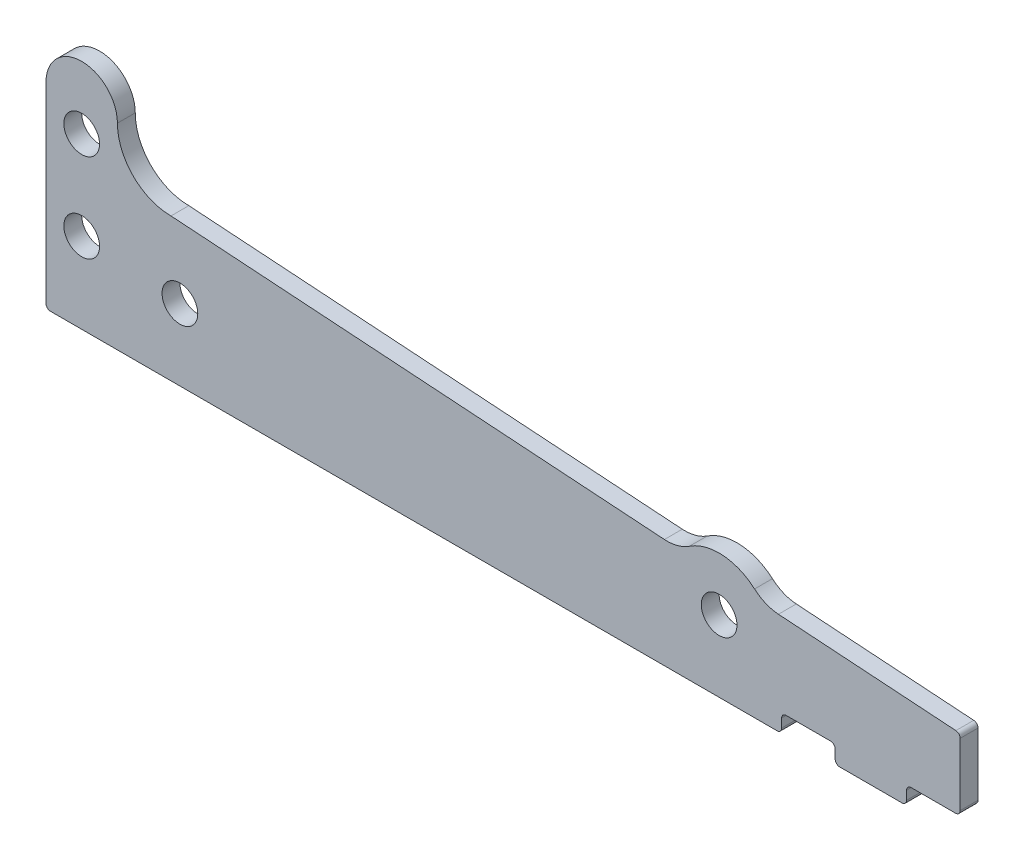
ISO-10303-21;
HEADER;
FILE_DESCRIPTION(('STEP AP214'),'2;1');
FILE_NAME('part.step','',(''),(''),'','','');
FILE_SCHEMA(('AUTOMOTIVE_DESIGN { 1 0 10303 214 1 1 1 1 }'));
ENDSEC;
DATA;
#1=APPLICATION_CONTEXT('core data for automotive mechanical design processes');
#2=APPLICATION_PROTOCOL_DEFINITION('international standard','automotive_design',2000,#1);
#3=PRODUCT_CONTEXT('',#1,'mechanical');
#4=PRODUCT('Part','Part','',(#3));
#5=PRODUCT_RELATED_PRODUCT_CATEGORY('part','',(#4));
#6=PRODUCT_DEFINITION_FORMATION('','',#4);
#7=PRODUCT_DEFINITION_CONTEXT('part definition',#1,'design');
#8=PRODUCT_DEFINITION('design','',#6,#7);
#9=PRODUCT_DEFINITION_SHAPE('','',#8);
#10=(LENGTH_UNIT() NAMED_UNIT(*) SI_UNIT(.MILLI.,.METRE.));
#11=(NAMED_UNIT(*) PLANE_ANGLE_UNIT() SI_UNIT($,.RADIAN.));
#12=(NAMED_UNIT(*) SI_UNIT($,.STERADIAN.) SOLID_ANGLE_UNIT());
#13=UNCERTAINTY_MEASURE_WITH_UNIT(LENGTH_MEASURE(1.E-05),#10,'distance_accuracy_value','');
#14=(GEOMETRIC_REPRESENTATION_CONTEXT(3) GLOBAL_UNCERTAINTY_ASSIGNED_CONTEXT((#13)) GLOBAL_UNIT_ASSIGNED_CONTEXT((#10,
#11,#12)) REPRESENTATION_CONTEXT('',''));
#15=CARTESIAN_POINT('',(0.,0.,0.));
#16=DIRECTION('',(0.,0.,1.));
#17=DIRECTION('',(1.,0.,0.));
#18=AXIS2_PLACEMENT_3D('',#15,#16,#17);
#19=CARTESIAN_POINT('',(11.1125,15.875,1.5875));
#20=DIRECTION('',(0.,0.,-1.));
#21=DIRECTION('',(-1.,0.,0.));
#22=AXIS2_PLACEMENT_3D('',#19,#20,#21);
#23=CYLINDRICAL_SURFACE('',#22,4.76250000000001);
#24=CARTESIAN_POINT('',(11.1125,15.875,0.));
#25=DIRECTION('',(0.,0.,1.));
#26=DIRECTION('',(1.,0.,0.));
#27=AXIS2_PLACEMENT_3D('',#24,#25,#26);
#28=CIRCLE('',#27,4.76250000000001);
#29=CARTESIAN_POINT('',(6.34999999999999,15.875,0.));
#30=VERTEX_POINT('',#29);
#31=CARTESIAN_POINT('',(11.1125,11.1125,0.));
#32=VERTEX_POINT('',#31);
#33=EDGE_CURVE('E210',#30,#32,#28,.T.);
#34=ORIENTED_EDGE('',*,*,#33,.F.);
#35=DIRECTION('',(0.,0.,-1.));
#36=VECTOR('',#35,1.);
#37=CARTESIAN_POINT('',(6.34999999999999,15.875,1.5875));
#38=LINE('',#37,#36);
#39=CARTESIAN_POINT('',(6.34999999999999,15.875,1.5875));
#40=VERTEX_POINT('',#39);
#41=EDGE_CURVE('E204',#40,#30,#38,.T.);
#42=ORIENTED_EDGE('',*,*,#41,.F.);
#43=CARTESIAN_POINT('',(11.1125,15.875,1.5875));
#44=DIRECTION('',(0.,0.,1.));
#45=DIRECTION('',(1.,0.,0.));
#46=AXIS2_PLACEMENT_3D('',#43,#44,#45);
#47=CIRCLE('',#46,4.76250000000001);
#48=CARTESIAN_POINT('',(11.1125,11.1125,1.5875));
#49=VERTEX_POINT('',#48);
#50=EDGE_CURVE('E207',#40,#49,#47,.T.);
#51=ORIENTED_EDGE('',*,*,#50,.T.);
#52=DIRECTION('',(0.,0.,-1.));
#53=VECTOR('',#52,1.);
#54=CARTESIAN_POINT('',(11.1125,11.1125,1.5875));
#55=LINE('',#54,#53);
#56=EDGE_CURVE('E276',#49,#32,#55,.T.);
#57=ORIENTED_EDGE('',*,*,#56,.T.);
#58=EDGE_LOOP('',(#34,#42,#51,#57));
#59=FACE_BOUND('',#58,.T.);
#60=ADVANCED_FACE('F39',(#59),#23,.F.);
#61=CARTESIAN_POINT('',(3.17499999999999,15.875,1.5875));
#62=DIRECTION('',(0.,0.,-1.));
#63=DIRECTION('',(-1.,0.,0.));
#64=AXIS2_PLACEMENT_3D('',#61,#62,#63);
#65=CYLINDRICAL_SURFACE('',#64,3.17499999999999);
#66=CARTESIAN_POINT('',(3.17499999999999,15.875,0.));
#67=DIRECTION('',(0.,0.,1.));
#68=DIRECTION('',(1.,0.,0.));
#69=AXIS2_PLACEMENT_3D('',#66,#67,#68);
#70=CIRCLE('',#69,3.17499999999999);
#71=CARTESIAN_POINT('',(0.,15.875,0.));
#72=VERTEX_POINT('',#71);
#73=EDGE_CURVE('E278',#30,#72,#70,.T.);
#74=ORIENTED_EDGE('',*,*,#73,.T.);
#75=DIRECTION('',(0.,0.,-1.));
#76=VECTOR('',#75,1.);
#77=CARTESIAN_POINT('',(0.,15.875,1.5875));
#78=LINE('',#77,#76);
#79=CARTESIAN_POINT('',(0.,15.875,1.5875));
#80=VERTEX_POINT('',#79);
#81=EDGE_CURVE('E215',#80,#72,#78,.T.);
#82=ORIENTED_EDGE('',*,*,#81,.F.);
#83=CARTESIAN_POINT('',(3.17499999999999,15.875,1.5875));
#84=DIRECTION('',(0.,0.,1.));
#85=DIRECTION('',(1.,0.,0.));
#86=AXIS2_PLACEMENT_3D('',#83,#84,#85);
#87=CIRCLE('',#86,3.17499999999999);
#88=EDGE_CURVE('E219',#40,#80,#87,.T.);
#89=ORIENTED_EDGE('',*,*,#88,.F.);
#90=ORIENTED_EDGE('',*,*,#41,.T.);
#91=EDGE_LOOP('',(#74,#82,#89,#90));
#92=FACE_BOUND('',#91,.T.);
#93=ADVANCED_FACE('F220',(#92),#65,.T.);
#94=CARTESIAN_POINT('',(0.,0.,1.5875));
#95=DIRECTION('',(-1.,0.,0.));
#96=DIRECTION('',(0.,0.,1.));
#97=AXIS2_PLACEMENT_3D('',#94,#95,#96);
#98=PLANE('',#97);
#99=DIRECTION('',(0.,1.,0.));
#100=VECTOR('',#99,1.);
#101=CARTESIAN_POINT('',(0.,0.,0.));
#102=LINE('',#101,#100);
#103=CARTESIAN_POINT('',(0.,-1.1811,0.));
#104=VERTEX_POINT('',#103);
#105=EDGE_CURVE('E280',#104,#72,#102,.T.);
#106=ORIENTED_EDGE('',*,*,#105,.F.);
#107=DIRECTION('',(0.,0.,-1.));
#108=VECTOR('',#107,1.);
#109=CARTESIAN_POINT('',(0.,-1.1811,1.5875));
#110=LINE('',#109,#108);
#111=CARTESIAN_POINT('',(0.,-1.1811,1.5875));
#112=VERTEX_POINT('',#111);
#113=EDGE_CURVE('E336',#104,#112,#110,.F.);
#114=ORIENTED_EDGE('',*,*,#113,.T.);
#115=DIRECTION('',(0.,1.,0.));
#116=VECTOR('',#115,1.);
#117=CARTESIAN_POINT('',(0.,0.,1.5875));
#118=LINE('',#117,#116);
#119=EDGE_CURVE('E224',#112,#80,#118,.T.);
#120=ORIENTED_EDGE('',*,*,#119,.T.);
#121=ORIENTED_EDGE('',*,*,#81,.T.);
#122=EDGE_LOOP('',(#106,#114,#120,#121));
#123=FACE_BOUND('',#122,.T.);
#124=ADVANCED_FACE('F513',(#123),#98,.T.);
#125=CARTESIAN_POINT('',(0.,-1.5875,1.5875));
#126=DIRECTION('',(0.,1.,0.));
#127=DIRECTION('',(0.,0.,1.));
#128=AXIS2_PLACEMENT_3D('',#125,#126,#127);
#129=PLANE('',#128);
#130=DIRECTION('',(1.,0.,0.));
#131=VECTOR('',#130,1.);
#132=CARTESIAN_POINT('',(0.,-1.5875,1.5875));
#133=LINE('',#132,#131);
#134=CARTESIAN_POINT('',(0.4064,-1.5875,1.5875));
#135=VERTEX_POINT('',#134);
#136=CARTESIAN_POINT('',(65.0010384,-1.5875,1.5875));
#137=VERTEX_POINT('',#136);
#138=EDGE_CURVE('E237',#135,#137,#133,.T.);
#139=ORIENTED_EDGE('',*,*,#138,.F.);
#140=DIRECTION('',(0.,0.,-1.));
#141=VECTOR('',#140,1.);
#142=CARTESIAN_POINT('',(0.4064,-1.5875,0.));
#143=LINE('',#142,#141);
#144=CARTESIAN_POINT('',(0.4064,-1.5875,0.));
#145=VERTEX_POINT('',#144);
#146=EDGE_CURVE('E321',#135,#145,#143,.T.);
#147=ORIENTED_EDGE('',*,*,#146,.T.);
#148=DIRECTION('',(1.,0.,0.));
#149=VECTOR('',#148,1.);
#150=CARTESIAN_POINT('',(0.,-1.5875,0.));
#151=LINE('',#150,#149);
#152=CARTESIAN_POINT('',(65.0010384,-1.5875,0.));
#153=VERTEX_POINT('',#152);
#154=EDGE_CURVE('E282',#145,#153,#151,.T.);
#155=ORIENTED_EDGE('',*,*,#154,.T.);
#156=DIRECTION('',(0.,0.,-1.));
#157=VECTOR('',#156,1.);
#158=CARTESIAN_POINT('',(65.0010384,-1.5875,1.5875));
#159=LINE('',#158,#157);
#160=EDGE_CURVE('E214',#153,#137,#159,.F.);
#161=ORIENTED_EDGE('',*,*,#160,.T.);
#162=EDGE_LOOP('',(#139,#147,#155,#161));
#163=FACE_BOUND('',#162,.T.);
#164=ADVANCED_FACE('F504',(#163),#129,.F.);
#165=CARTESIAN_POINT('',(65.4074384,0.,1.5875));
#166=DIRECTION('',(1.,0.,0.));
#167=DIRECTION('',(0.,0.,-1.));
#168=AXIS2_PLACEMENT_3D('',#165,#166,#167);
#169=PLANE('',#168);
#170=DIRECTION('',(0.,-1.,0.));
#171=VECTOR('',#170,1.);
#172=CARTESIAN_POINT('',(65.4074384,0.,0.));
#173=LINE('',#172,#171);
#174=CARTESIAN_POINT('',(65.4074384,-0.4064,0.));
#175=VERTEX_POINT('',#174);
#176=CARTESIAN_POINT('',(65.4074384,-1.1811,0.));
#177=VERTEX_POINT('',#176);
#178=EDGE_CURVE('E288',#175,#177,#173,.T.);
#179=ORIENTED_EDGE('',*,*,#178,.F.);
#180=DIRECTION('',(0.,0.,-1.));
#181=VECTOR('',#180,1.);
#182=CARTESIAN_POINT('',(65.4074384,-0.4064,1.5875));
#183=LINE('',#182,#181);
#184=CARTESIAN_POINT('',(65.4074384,-0.4064,1.5875));
#185=VERTEX_POINT('',#184);
#186=EDGE_CURVE('E387',#175,#185,#183,.F.);
#187=ORIENTED_EDGE('',*,*,#186,.T.);
#188=DIRECTION('',(0.,-1.,0.));
#189=VECTOR('',#188,1.);
#190=CARTESIAN_POINT('',(65.4074384,0.,1.5875));
#191=LINE('',#190,#189);
#192=CARTESIAN_POINT('',(65.4074384,-1.1811,1.5875));
#193=VERTEX_POINT('',#192);
#194=EDGE_CURVE('E243',#185,#193,#191,.T.);
#195=ORIENTED_EDGE('',*,*,#194,.T.);
#196=DIRECTION('',(0.,0.,-1.));
#197=VECTOR('',#196,1.);
#198=CARTESIAN_POINT('',(65.4074384,-1.1811,0.));
#199=LINE('',#198,#197);
#200=EDGE_CURVE('E384',#193,#177,#199,.T.);
#201=ORIENTED_EDGE('',*,*,#200,.T.);
#202=EDGE_LOOP('',(#179,#187,#195,#201));
#203=FACE_BOUND('',#202,.T.);
#204=ADVANCED_FACE('F494',(#203),#169,.T.);
#205=CARTESIAN_POINT('',(0.,0.,1.5875));
#206=DIRECTION('',(0.,-1.,0.));
#207=DIRECTION('',(1.,0.,0.));
#208=AXIS2_PLACEMENT_3D('',#205,#206,#207);
#209=PLANE('',#208);
#210=DIRECTION('',(-1.,0.,0.));
#211=VECTOR('',#210,1.);
#212=CARTESIAN_POINT('',(0.,0.,0.));
#213=LINE('',#212,#211);
#214=CARTESIAN_POINT('',(69.7635384,0.,0.));
#215=VERTEX_POINT('',#214);
#216=CARTESIAN_POINT('',(65.8138384,0.,0.));
#217=VERTEX_POINT('',#216);
#218=EDGE_CURVE('E291',#215,#217,#213,.T.);
#219=ORIENTED_EDGE('',*,*,#218,.F.);
#220=DIRECTION('',(0.,0.,-1.));
#221=VECTOR('',#220,1.);
#222=CARTESIAN_POINT('',(69.7635384,0.,1.5875));
#223=LINE('',#222,#221);
#224=CARTESIAN_POINT('',(69.7635384,0.,1.5875));
#225=VERTEX_POINT('',#224);
#226=EDGE_CURVE('E382',#215,#225,#223,.F.);
#227=ORIENTED_EDGE('',*,*,#226,.T.);
#228=DIRECTION('',(-1.,0.,0.));
#229=VECTOR('',#228,1.);
#230=CARTESIAN_POINT('',(0.,0.,1.5875));
#231=LINE('',#230,#229);
#232=CARTESIAN_POINT('',(65.8138384,0.,1.5875));
#233=VERTEX_POINT('',#232);
#234=EDGE_CURVE('E246',#225,#233,#231,.T.);
#235=ORIENTED_EDGE('',*,*,#234,.T.);
#236=DIRECTION('',(0.,0.,-1.));
#237=VECTOR('',#236,1.);
#238=CARTESIAN_POINT('',(65.8138384,0.,0.));
#239=LINE('',#238,#237);
#240=EDGE_CURVE('E379',#233,#217,#239,.T.);
#241=ORIENTED_EDGE('',*,*,#240,.T.);
#242=EDGE_LOOP('',(#219,#227,#235,#241));
#243=FACE_BOUND('',#242,.T.);
#244=ADVANCED_FACE('F485',(#243),#209,.T.);
#245=CARTESIAN_POINT('',(70.1699384,0.,1.5875));
#246=DIRECTION('',(1.,0.,0.));
#247=DIRECTION('',(0.,0.,-1.));
#248=AXIS2_PLACEMENT_3D('',#245,#246,#247);
#249=PLANE('',#248);
#250=DIRECTION('',(0.,-1.,0.));
#251=VECTOR('',#250,1.);
#252=CARTESIAN_POINT('',(70.1699384,0.,0.));
#253=LINE('',#252,#251);
#254=CARTESIAN_POINT('',(70.1699384,-0.4064,0.));
#255=VERTEX_POINT('',#254);
#256=CARTESIAN_POINT('',(70.1699384,-1.1811,0.));
#257=VERTEX_POINT('',#256);
#258=EDGE_CURVE('E287',#255,#257,#253,.T.);
#259=ORIENTED_EDGE('',*,*,#258,.T.);
#260=DIRECTION('',(0.,0.,-1.));
#261=VECTOR('',#260,1.);
#262=CARTESIAN_POINT('',(70.1699384,-1.1811,1.5875));
#263=LINE('',#262,#261);
#264=CARTESIAN_POINT('',(70.1699384,-1.1811,1.5875));
#265=VERTEX_POINT('',#264);
#266=EDGE_CURVE('E377',#257,#265,#263,.F.);
#267=ORIENTED_EDGE('',*,*,#266,.T.);
#268=DIRECTION('',(0.,-1.,0.));
#269=VECTOR('',#268,1.);
#270=CARTESIAN_POINT('',(70.1699384,0.,1.5875));
#271=LINE('',#270,#269);
#272=CARTESIAN_POINT('',(70.1699384,-0.4064,1.5875));
#273=VERTEX_POINT('',#272);
#274=EDGE_CURVE('E242',#273,#265,#271,.T.);
#275=ORIENTED_EDGE('',*,*,#274,.F.);
#276=DIRECTION('',(0.,0.,-1.));
#277=VECTOR('',#276,1.);
#278=CARTESIAN_POINT('',(70.1699384,-0.4064,1.5875));
#279=LINE('',#278,#277);
#280=EDGE_CURVE('E374',#273,#255,#279,.T.);
#281=ORIENTED_EDGE('',*,*,#280,.T.);
#282=EDGE_LOOP('',(#259,#267,#275,#281));
#283=FACE_BOUND('',#282,.T.);
#284=ADVANCED_FACE('F476',(#283),#249,.F.);
#285=CARTESIAN_POINT('',(70.5763384,-1.5875,0.));
#286=VERTEX_POINT('',#285);
#287=CARTESIAN_POINT('',(76.1135384,-1.5875,0.));
#288=VERTEX_POINT('',#287);
#289=EDGE_CURVE('E283',#286,#288,#151,.T.);
#290=ORIENTED_EDGE('',*,*,#289,.T.);
#291=DIRECTION('',(0.,0.,-1.));
#292=VECTOR('',#291,1.);
#293=CARTESIAN_POINT('',(76.1135384,-1.5875,1.5875));
#294=LINE('',#293,#292);
#295=CARTESIAN_POINT('',(76.1135384,-1.5875,1.5875));
#296=VERTEX_POINT('',#295);
#297=EDGE_CURVE('E372',#288,#296,#294,.F.);
#298=ORIENTED_EDGE('',*,*,#297,.T.);
#299=CARTESIAN_POINT('',(70.5763384,-1.5875,1.5875));
#300=VERTEX_POINT('',#299);
#301=EDGE_CURVE('E238',#300,#296,#133,.T.);
#302=ORIENTED_EDGE('',*,*,#301,.F.);
#303=DIRECTION('',(0.,0.,-1.));
#304=VECTOR('',#303,1.);
#305=CARTESIAN_POINT('',(70.5763384,-1.5875,1.5875));
#306=LINE('',#305,#304);
#307=EDGE_CURVE('E369',#300,#286,#306,.T.);
#308=ORIENTED_EDGE('',*,*,#307,.T.);
#309=EDGE_LOOP('',(#290,#298,#302,#308));
#310=FACE_BOUND('',#309,.T.);
#311=ADVANCED_FACE('F467',(#310),#129,.F.);
#312=CARTESIAN_POINT('',(76.5199384,0.,1.5875));
#313=DIRECTION('',(-1.,0.,0.));
#314=DIRECTION('',(0.,0.,1.));
#315=AXIS2_PLACEMENT_3D('',#312,#313,#314);
#316=PLANE('',#315);
#317=DIRECTION('',(0.,1.,0.));
#318=VECTOR('',#317,1.);
#319=CARTESIAN_POINT('',(76.5199384,0.,0.));
#320=LINE('',#319,#318);
#321=CARTESIAN_POINT('',(76.5199384,-1.1811,0.));
#322=VERTEX_POINT('',#321);
#323=CARTESIAN_POINT('',(76.5199384,-0.4064,0.));
#324=VERTEX_POINT('',#323);
#325=EDGE_CURVE('E286',#322,#324,#320,.T.);
#326=ORIENTED_EDGE('',*,*,#325,.T.);
#327=DIRECTION('',(0.,0.,-1.));
#328=VECTOR('',#327,1.);
#329=CARTESIAN_POINT('',(76.5199384,-0.4064,1.5875));
#330=LINE('',#329,#328);
#331=CARTESIAN_POINT('',(76.5199384,-0.4064,1.5875));
#332=VERTEX_POINT('',#331);
#333=EDGE_CURVE('E367',#324,#332,#330,.F.);
#334=ORIENTED_EDGE('',*,*,#333,.T.);
#335=DIRECTION('',(0.,1.,0.));
#336=VECTOR('',#335,1.);
#337=CARTESIAN_POINT('',(76.5199384,0.,1.5875));
#338=LINE('',#337,#336);
#339=CARTESIAN_POINT('',(76.5199384,-1.1811,1.5875));
#340=VERTEX_POINT('',#339);
#341=EDGE_CURVE('E241',#340,#332,#338,.T.);
#342=ORIENTED_EDGE('',*,*,#341,.F.);
#343=DIRECTION('',(0.,0.,-1.));
#344=VECTOR('',#343,1.);
#345=CARTESIAN_POINT('',(76.5199384,-1.1811,1.5875));
#346=LINE('',#345,#344);
#347=EDGE_CURVE('E364',#340,#322,#346,.T.);
#348=ORIENTED_EDGE('',*,*,#347,.T.);
#349=EDGE_LOOP('',(#326,#334,#342,#348));
#350=FACE_BOUND('',#349,.T.);
#351=ADVANCED_FACE('F458',(#350),#316,.F.);
#352=CARTESIAN_POINT('',(0.,0.,1.5875));
#353=DIRECTION('',(0.,-1.,0.));
#354=DIRECTION('',(0.,0.,-1.));
#355=AXIS2_PLACEMENT_3D('',#352,#353,#354);
#356=PLANE('',#355);
#357=DIRECTION('',(-1.,0.,0.));
#358=VECTOR('',#357,1.);
#359=CARTESIAN_POINT('',(0.,0.,0.));
#360=LINE('',#359,#358);
#361=CARTESIAN_POINT('',(80.8760384,0.,0.));
#362=VERTEX_POINT('',#361);
#363=CARTESIAN_POINT('',(76.9263384,0.,0.));
#364=VERTEX_POINT('',#363);
#365=EDGE_CURVE('E298',#362,#364,#360,.T.);
#366=ORIENTED_EDGE('',*,*,#365,.F.);
#367=DIRECTION('',(0.,0.,-1.));
#368=VECTOR('',#367,1.);
#369=CARTESIAN_POINT('',(80.8760384,0.,1.5875));
#370=LINE('',#369,#368);
#371=CARTESIAN_POINT('',(80.8760384,0.,1.5875));
#372=VERTEX_POINT('',#371);
#373=EDGE_CURVE('E362',#362,#372,#370,.F.);
#374=ORIENTED_EDGE('',*,*,#373,.T.);
#375=DIRECTION('',(-1.,0.,0.));
#376=VECTOR('',#375,1.);
#377=CARTESIAN_POINT('',(0.,0.,1.5875));
#378=LINE('',#377,#376);
#379=CARTESIAN_POINT('',(76.9263384,0.,1.5875));
#380=VERTEX_POINT('',#379);
#381=EDGE_CURVE('E253',#372,#380,#378,.T.);
#382=ORIENTED_EDGE('',*,*,#381,.T.);
#383=DIRECTION('',(0.,0.,-1.));
#384=VECTOR('',#383,1.);
#385=CARTESIAN_POINT('',(76.9263384,0.,1.5875));
#386=LINE('',#385,#384);
#387=EDGE_CURVE('E359',#380,#364,#386,.T.);
#388=ORIENTED_EDGE('',*,*,#387,.T.);
#389=EDGE_LOOP('',(#366,#374,#382,#388));
#390=FACE_BOUND('',#389,.T.);
#391=ADVANCED_FACE('F449',(#390),#356,.T.);
#392=CARTESIAN_POINT('',(81.2824384,0.,1.5875));
#393=DIRECTION('',(1.,0.,0.));
#394=DIRECTION('',(0.,0.,-1.));
#395=AXIS2_PLACEMENT_3D('',#392,#393,#394);
#396=PLANE('',#395);
#397=DIRECTION('',(0.,-1.,0.));
#398=VECTOR('',#397,1.);
#399=CARTESIAN_POINT('',(81.2824384,0.,0.));
#400=LINE('',#399,#398);
#401=CARTESIAN_POINT('',(81.2824384,5.97024779363954,0.));
#402=VERTEX_POINT('',#401);
#403=CARTESIAN_POINT('',(81.2824384,0.4064,0.));
#404=VERTEX_POINT('',#403);
#405=EDGE_CURVE('E301',#402,#404,#400,.T.);
#406=ORIENTED_EDGE('',*,*,#405,.F.);
#407=DIRECTION('',(0.,0.,-1.));
#408=VECTOR('',#407,1.);
#409=CARTESIAN_POINT('',(81.2824384,5.97024779363954,1.5875));
#410=LINE('',#409,#408);
#411=CARTESIAN_POINT('',(81.2824384,5.97024779363954,1.5875));
#412=VERTEX_POINT('',#411);
#413=EDGE_CURVE('E357',#402,#412,#410,.F.);
#414=ORIENTED_EDGE('',*,*,#413,.T.);
#415=DIRECTION('',(0.,-1.,0.));
#416=VECTOR('',#415,1.);
#417=CARTESIAN_POINT('',(81.2824384,0.,1.5875));
#418=LINE('',#417,#416);
#419=CARTESIAN_POINT('',(81.2824384,0.4064,1.5875));
#420=VERTEX_POINT('',#419);
#421=EDGE_CURVE('E256',#412,#420,#418,.T.);
#422=ORIENTED_EDGE('',*,*,#421,.T.);
#423=DIRECTION('',(0.,0.,-1.));
#424=VECTOR('',#423,1.);
#425=CARTESIAN_POINT('',(81.2824384,0.4064,1.5875));
#426=LINE('',#425,#424);
#427=EDGE_CURVE('E354',#420,#404,#426,.T.);
#428=ORIENTED_EDGE('',*,*,#427,.T.);
#429=EDGE_LOOP('',(#406,#414,#422,#428));
#430=FACE_BOUND('',#429,.T.);
#431=ADVANCED_FACE('F441',(#430),#396,.T.);
#432=CARTESIAN_POINT('',(0.801712156130444,11.8123029102791,1.5875));
#433=DIRECTION('',(0.0677151600119668,0.997704694338236,0.));
#434=DIRECTION('',(-0.997704694338237,0.0677151600119668,0.));
#435=AXIS2_PLACEMENT_3D('',#432,#433,#434);
#436=PLANE('',#435);
#437=DIRECTION('',(0.997704694338236,-0.0677151600119668,0.));
#438=VECTOR('',#437,1.);
#439=CARTESIAN_POINT('',(0.801712156130444,11.8123029102791,0.));
#440=LINE('',#439,#438);
#441=CARTESIAN_POINT('',(65.1254020205421,7.44659332061161,0.));
#442=VERTEX_POINT('',#441);
#443=CARTESIAN_POINT('',(80.9035578410289,6.37571498141859,0.));
#444=VERTEX_POINT('',#443);
#445=EDGE_CURVE('E304',#442,#444,#440,.T.);
#446=ORIENTED_EDGE('',*,*,#445,.F.);
#447=DIRECTION('',(0.,0.,-1.));
#448=VECTOR('',#447,1.);
#449=CARTESIAN_POINT('',(65.1254020205421,7.44659332061161,1.5875));
#450=LINE('',#449,#448);
#451=CARTESIAN_POINT('',(65.1254020205421,7.44659332061161,1.5875));
#452=VERTEX_POINT('',#451);
#453=EDGE_CURVE('E60',#442,#452,#450,.F.);
#454=ORIENTED_EDGE('',*,*,#453,.T.);
#455=DIRECTION('',(0.997704694338236,-0.0677151600119668,0.));
#456=VECTOR('',#455,1.);
#457=CARTESIAN_POINT('',(0.801712156130444,11.8123029102791,1.5875));
#458=LINE('',#457,#456);
#459=CARTESIAN_POINT('',(80.9035578410289,6.37571498141859,1.5875));
#460=VERTEX_POINT('',#459);
#461=EDGE_CURVE('E259',#452,#460,#458,.T.);
#462=ORIENTED_EDGE('',*,*,#461,.T.);
#463=DIRECTION('',(0.,0.,-1.));
#464=VECTOR('',#463,1.);
#465=CARTESIAN_POINT('',(80.9035578410289,6.37571498141859,1.5875));
#466=LINE('',#465,#464);
#467=EDGE_CURVE('E351',#460,#444,#466,.T.);
#468=ORIENTED_EDGE('',*,*,#467,.T.);
#469=EDGE_LOOP('',(#446,#454,#462,#468));
#470=FACE_BOUND('',#469,.T.);
#471=ADVANCED_FACE('F434',(#470),#436,.T.);
#472=CARTESIAN_POINT('',(59.8511884,4.7625,1.5875));
#473=DIRECTION('',(0.,0.,-1.));
#474=DIRECTION('',(-1.,0.,0.));
#475=AXIS2_PLACEMENT_3D('',#472,#473,#474);
#476=CYLINDRICAL_SURFACE('',#475,4.76250000000001);
#477=CARTESIAN_POINT('',(59.8511884,4.7625,0.));
#478=DIRECTION('',(0.,0.,1.));
#479=DIRECTION('',(1.,0.,0.));
#480=AXIS2_PLACEMENT_3D('',#477,#478,#479);
#481=CIRCLE('',#480,4.76250000000001);
#482=CARTESIAN_POINT('',(63.0032362329771,8.33265415754344,0.));
#483=VERTEX_POINT('',#482);
#484=CARTESIAN_POINT('',(57.2104443307577,8.72581641567533,0.));
#485=VERTEX_POINT('',#484);
#486=EDGE_CURVE('E306',#483,#485,#481,.T.);
#487=ORIENTED_EDGE('',*,*,#486,.T.);
#488=DIRECTION('',(0.,0.,-1.));
#489=VECTOR('',#488,1.);
#490=CARTESIAN_POINT('',(57.2104443307577,8.72581641567533,1.5875));
#491=LINE('',#490,#489);
#492=CARTESIAN_POINT('',(57.2104443307577,8.72581641567533,1.5875));
#493=VERTEX_POINT('',#492);
#494=EDGE_CURVE('E407',#485,#493,#491,.F.);
#495=ORIENTED_EDGE('',*,*,#494,.T.);
#496=CARTESIAN_POINT('',(59.8511884,4.7625,1.5875));
#497=DIRECTION('',(0.,0.,1.));
#498=DIRECTION('',(1.,0.,0.));
#499=AXIS2_PLACEMENT_3D('',#496,#497,#498);
#500=CIRCLE('',#499,4.76250000000001);
#501=CARTESIAN_POINT('',(63.0032362329771,8.33265415754344,1.5875));
#502=VERTEX_POINT('',#501);
#503=EDGE_CURVE('E261',#502,#493,#500,.T.);
#504=ORIENTED_EDGE('',*,*,#503,.F.);
#505=DIRECTION('',(0.,0.,-1.));
#506=VECTOR('',#505,1.);
#507=CARTESIAN_POINT('',(63.0032362329771,8.33265415754343,1.5875));
#508=LINE('',#507,#506);
#509=EDGE_CURVE('E404',#502,#483,#508,.T.);
#510=ORIENTED_EDGE('',*,*,#509,.T.);
#511=EDGE_LOOP('',(#487,#495,#504,#510));
#512=FACE_BOUND('',#511,.T.);
#513=ADVANCED_FACE('F427',(#512),#476,.T.);
#514=CARTESIAN_POINT('',(11.90625,4.7625,1.5875));
#515=DIRECTION('',(0.,0.,-1.));
#516=DIRECTION('',(-1.,0.,0.));
#517=AXIS2_PLACEMENT_3D('',#514,#515,#516);
#518=CYLINDRICAL_SURFACE('',#517,1.5875);
#519=CARTESIAN_POINT('',(11.90625,4.7625,1.5875));
#520=DIRECTION('',(0.,0.,1.));
#521=DIRECTION('',(1.,0.,0.));
#522=AXIS2_PLACEMENT_3D('',#519,#520,#521);
#523=CIRCLE('',#522,1.5875);
#524=CARTESIAN_POINT('',(13.49375,4.7625,1.5875));
#525=VERTEX_POINT('',#524);
#526=EDGE_CURVE('E270',#525,#525,#523,.T.);
#527=ORIENTED_EDGE('',*,*,#526,.T.);
#528=EDGE_LOOP('',(#527));
#529=FACE_BOUND('',#528,.T.);
#530=CARTESIAN_POINT('',(11.90625,4.7625,0.));
#531=DIRECTION('',(0.,0.,1.));
#532=DIRECTION('',(1.,0.,0.));
#533=AXIS2_PLACEMENT_3D('',#530,#531,#532);
#534=CIRCLE('',#533,1.5875);
#535=CARTESIAN_POINT('',(13.49375,4.7625,0.));
#536=VERTEX_POINT('',#535);
#537=EDGE_CURVE('E233',#536,#536,#534,.T.);
#538=ORIENTED_EDGE('',*,*,#537,.F.);
#539=EDGE_LOOP('',(#538));
#540=FACE_BOUND('',#539,.T.);
#541=ADVANCED_FACE('F599',(#529,#540),#518,.F.);
#542=CARTESIAN_POINT('',(3.17499999999999,5.588,1.5875));
#543=DIRECTION('',(0.,0.,-1.));
#544=DIRECTION('',(-1.,0.,0.));
#545=AXIS2_PLACEMENT_3D('',#542,#543,#544);
#546=CYLINDRICAL_SURFACE('',#545,1.5875);
#547=CARTESIAN_POINT('',(3.17499999999999,5.588,1.5875));
#548=DIRECTION('',(0.,0.,1.));
#549=DIRECTION('',(1.,0.,0.));
#550=AXIS2_PLACEMENT_3D('',#547,#548,#549);
#551=CIRCLE('',#550,1.5875);
#552=CARTESIAN_POINT('',(4.76249999999999,5.588,1.5875));
#553=VERTEX_POINT('',#552);
#554=EDGE_CURVE('E267',#553,#553,#551,.T.);
#555=ORIENTED_EDGE('',*,*,#554,.T.);
#556=EDGE_LOOP('',(#555));
#557=FACE_BOUND('',#556,.T.);
#558=CARTESIAN_POINT('',(3.17499999999999,5.588,0.));
#559=DIRECTION('',(0.,0.,1.));
#560=DIRECTION('',(1.,0.,0.));
#561=AXIS2_PLACEMENT_3D('',#558,#559,#560);
#562=CIRCLE('',#561,1.5875);
#563=CARTESIAN_POINT('',(4.76249999999999,5.588,0.));
#564=VERTEX_POINT('',#563);
#565=EDGE_CURVE('E313',#564,#564,#562,.T.);
#566=ORIENTED_EDGE('',*,*,#565,.F.);
#567=EDGE_LOOP('',(#566));
#568=FACE_BOUND('',#567,.T.);
#569=ADVANCED_FACE('F740',(#557,#568),#546,.F.);
#570=CARTESIAN_POINT('',(3.17499999999999,13.462,1.5875));
#571=DIRECTION('',(0.,0.,-1.));
#572=DIRECTION('',(-1.,0.,0.));
#573=AXIS2_PLACEMENT_3D('',#570,#571,#572);
#574=CYLINDRICAL_SURFACE('',#573,1.5875);
#575=CARTESIAN_POINT('',(3.17499999999999,13.462,1.5875));
#576=DIRECTION('',(0.,0.,1.));
#577=DIRECTION('',(1.,0.,0.));
#578=AXIS2_PLACEMENT_3D('',#575,#576,#577);
#579=CIRCLE('',#578,1.5875);
#580=CARTESIAN_POINT('',(4.76249999999999,13.462,1.5875));
#581=VERTEX_POINT('',#580);
#582=EDGE_CURVE('E264',#581,#581,#579,.T.);
#583=ORIENTED_EDGE('',*,*,#582,.T.);
#584=EDGE_LOOP('',(#583));
#585=FACE_BOUND('',#584,.T.);
#586=CARTESIAN_POINT('',(3.17499999999999,13.462,0.));
#587=DIRECTION('',(0.,0.,1.));
#588=DIRECTION('',(1.,0.,0.));
#589=AXIS2_PLACEMENT_3D('',#586,#587,#588);
#590=CIRCLE('',#589,1.5875);
#591=CARTESIAN_POINT('',(4.76249999999999,13.462,0.));
#592=VERTEX_POINT('',#591);
#593=EDGE_CURVE('E310',#592,#592,#590,.T.);
#594=ORIENTED_EDGE('',*,*,#593,.F.);
#595=EDGE_LOOP('',(#594));
#596=FACE_BOUND('',#595,.T.);
#597=ADVANCED_FACE('F587',(#585,#596),#574,.F.);
#598=CARTESIAN_POINT('',(54.9880161916582,8.13462727234242,1.5875));
#599=VERTEX_POINT('',#598);
#600=EDGE_CURVE('E229',#49,#599,#458,.T.);
#601=ORIENTED_EDGE('',*,*,#600,.T.);
#602=DIRECTION('',(0.,0.,-1.));
#603=VECTOR('',#602,1.);
#604=CARTESIAN_POINT('',(54.9880161916581,8.13462727234242,1.5875));
#605=LINE('',#604,#603);
#606=CARTESIAN_POINT('',(54.9880161916582,8.13462727234242,0.));
#607=VERTEX_POINT('',#606);
#608=EDGE_CURVE('E401',#599,#607,#605,.T.);
#609=ORIENTED_EDGE('',*,*,#608,.T.);
#610=EDGE_CURVE('E307',#32,#607,#440,.T.);
#611=ORIENTED_EDGE('',*,*,#610,.F.);
#612=ORIENTED_EDGE('',*,*,#56,.F.);
#613=EDGE_LOOP('',(#601,#609,#611,#612));
#614=FACE_BOUND('',#613,.T.);
#615=ADVANCED_FACE('F419',(#614),#436,.T.);
#616=CARTESIAN_POINT('',(59.8511884,4.7625,1.5875));
#617=DIRECTION('',(0.,0.,-1.));
#618=DIRECTION('',(-1.,0.,0.));
#619=AXIS2_PLACEMENT_3D('',#616,#617,#618);
#620=CYLINDRICAL_SURFACE('',#619,1.5875);
#621=CARTESIAN_POINT('',(59.8511884,4.7625,1.5875));
#622=DIRECTION('',(0.,0.,1.));
#623=DIRECTION('',(1.,0.,0.));
#624=AXIS2_PLACEMENT_3D('',#621,#622,#623);
#625=CIRCLE('',#624,1.5875);
#626=CARTESIAN_POINT('',(61.4386884,4.7625,1.5875));
#627=VERTEX_POINT('',#626);
#628=EDGE_CURVE('E273',#627,#627,#625,.T.);
#629=ORIENTED_EDGE('',*,*,#628,.T.);
#630=EDGE_LOOP('',(#629));
#631=FACE_BOUND('',#630,.T.);
#632=CARTESIAN_POINT('',(59.8511884,4.7625,0.));
#633=DIRECTION('',(0.,0.,1.));
#634=DIRECTION('',(1.,0.,0.));
#635=AXIS2_PLACEMENT_3D('',#632,#633,#634);
#636=CIRCLE('',#635,1.5875);
#637=CARTESIAN_POINT('',(61.4386884,4.7625,0.));
#638=VERTEX_POINT('',#637);
#639=EDGE_CURVE('E230',#638,#638,#636,.T.);
#640=ORIENTED_EDGE('',*,*,#639,.F.);
#641=EDGE_LOOP('',(#640));
#642=FACE_BOUND('',#641,.T.);
#643=ADVANCED_FACE('F575',(#631,#642),#620,.F.);
#644=CARTESIAN_POINT('',(0.,0.,1.5875));
#645=DIRECTION('',(0.,0.,1.));
#646=DIRECTION('',(1.,0.,0.));
#647=AXIS2_PLACEMENT_3D('',#644,#645,#646);
#648=PLANE('',#647);
#649=ORIENTED_EDGE('',*,*,#119,.F.);
#650=CARTESIAN_POINT('',(0.4064,-1.1811,1.5875));
#651=DIRECTION('',(0.,0.,1.));
#652=DIRECTION('',(1.,0.,0.));
#653=AXIS2_PLACEMENT_3D('',#650,#651,#652);
#654=CIRCLE('',#653,0.4064);
#655=EDGE_CURVE('E349',#112,#135,#654,.T.);
#656=ORIENTED_EDGE('',*,*,#655,.T.);
#657=ORIENTED_EDGE('',*,*,#138,.T.);
#658=CARTESIAN_POINT('',(65.0010384,-1.1811,1.5875));
#659=DIRECTION('',(0.,0.,1.));
#660=DIRECTION('',(1.,0.,0.));
#661=AXIS2_PLACEMENT_3D('',#658,#659,#660);
#662=CIRCLE('',#661,0.4064);
#663=EDGE_CURVE('E338',#137,#193,#662,.T.);
#664=ORIENTED_EDGE('',*,*,#663,.T.);
#665=ORIENTED_EDGE('',*,*,#194,.F.);
#666=CARTESIAN_POINT('',(65.8138384,-0.4064,1.5875));
#667=DIRECTION('',(0.,0.,1.));
#668=DIRECTION('',(1.,0.,0.));
#669=AXIS2_PLACEMENT_3D('',#666,#667,#668);
#670=CIRCLE('',#669,0.4064);
#671=EDGE_CURVE('E399',#185,#233,#670,.F.);
#672=ORIENTED_EDGE('',*,*,#671,.T.);
#673=ORIENTED_EDGE('',*,*,#234,.F.);
#674=CARTESIAN_POINT('',(69.7635384,-0.4064,1.5875));
#675=DIRECTION('',(0.,0.,1.));
#676=DIRECTION('',(1.,0.,0.));
#677=AXIS2_PLACEMENT_3D('',#674,#675,#676);
#678=CIRCLE('',#677,0.4064);
#679=EDGE_CURVE('E395',#225,#273,#678,.F.);
#680=ORIENTED_EDGE('',*,*,#679,.T.);
#681=ORIENTED_EDGE('',*,*,#274,.T.);
#682=CARTESIAN_POINT('',(70.5763384,-1.1811,1.5875));
#683=DIRECTION('',(0.,0.,1.));
#684=DIRECTION('',(1.,0.,0.));
#685=AXIS2_PLACEMENT_3D('',#682,#683,#684);
#686=CIRCLE('',#685,0.4064);
#687=EDGE_CURVE('E340',#265,#300,#686,.T.);
#688=ORIENTED_EDGE('',*,*,#687,.T.);
#689=ORIENTED_EDGE('',*,*,#301,.T.);
#690=CARTESIAN_POINT('',(76.1135384,-1.1811,1.5875));
#691=DIRECTION('',(0.,0.,1.));
#692=DIRECTION('',(1.,0.,0.));
#693=AXIS2_PLACEMENT_3D('',#690,#691,#692);
#694=CIRCLE('',#693,0.4064);
#695=EDGE_CURVE('E342',#296,#340,#694,.T.);
#696=ORIENTED_EDGE('',*,*,#695,.T.);
#697=ORIENTED_EDGE('',*,*,#341,.T.);
#698=CARTESIAN_POINT('',(76.9263384,-0.4064,1.5875));
#699=DIRECTION('',(0.,0.,1.));
#700=DIRECTION('',(1.,0.,0.));
#701=AXIS2_PLACEMENT_3D('',#698,#699,#700);
#702=CIRCLE('',#701,0.4064);
#703=EDGE_CURVE('E391',#332,#380,#702,.F.);
#704=ORIENTED_EDGE('',*,*,#703,.T.);
#705=ORIENTED_EDGE('',*,*,#381,.F.);
#706=CARTESIAN_POINT('',(80.8760384,0.4064,1.5875));
#707=DIRECTION('',(0.,0.,1.));
#708=DIRECTION('',(1.,0.,0.));
#709=AXIS2_PLACEMENT_3D('',#706,#707,#708);
#710=CIRCLE('',#709,0.4064);
#711=EDGE_CURVE('E344',#372,#420,#710,.T.);
#712=ORIENTED_EDGE('',*,*,#711,.T.);
#713=ORIENTED_EDGE('',*,*,#421,.F.);
#714=CARTESIAN_POINT('',(80.8760384,5.97024779363954,1.5875));
#715=DIRECTION('',(0.,0.,1.));
#716=DIRECTION('',(1.,0.,0.));
#717=AXIS2_PLACEMENT_3D('',#714,#715,#716);
#718=CIRCLE('',#717,0.4064);
#719=EDGE_CURVE('E346',#412,#460,#718,.T.);
#720=ORIENTED_EDGE('',*,*,#719,.T.);
#721=ORIENTED_EDGE('',*,*,#461,.F.);
#722=CARTESIAN_POINT('',(65.3672721077099,11.010269775701,1.5875));
#723=DIRECTION('',(0.,0.,1.));
#724=DIRECTION('',(1.,0.,0.));
#725=AXIS2_PLACEMENT_3D('',#722,#723,#724);
#726=CIRCLE('',#725,3.571875);
#727=EDGE_CURVE('E11',#452,#502,#726,.F.);
#728=ORIENTED_EDGE('',*,*,#727,.T.);
#729=ORIENTED_EDGE('',*,*,#503,.T.);
#730=CARTESIAN_POINT('',(55.2298862788259,11.6983037274318,1.5875));
#731=DIRECTION('',(0.,0.,1.));
#732=DIRECTION('',(1.,0.,0.));
#733=AXIS2_PLACEMENT_3D('',#730,#731,#732);
#734=CIRCLE('',#733,3.571875);
#735=EDGE_CURVE('E412',#493,#599,#734,.F.);
#736=ORIENTED_EDGE('',*,*,#735,.T.);
#737=ORIENTED_EDGE('',*,*,#600,.F.);
#738=ORIENTED_EDGE('',*,*,#50,.F.);
#739=ORIENTED_EDGE('',*,*,#88,.T.);
#740=EDGE_LOOP('',(#649,#656,#657,#664,#665,#672,#673,#680,#681,#688,#689,#696,#697,#704,#705,
#712,#713,#720,#721,#728,#729,#736,#737,#738,#739));
#741=FACE_BOUND('',#740,.T.);
#742=ORIENTED_EDGE('',*,*,#582,.F.);
#743=EDGE_LOOP('',(#742));
#744=FACE_BOUND('',#743,.T.);
#745=ORIENTED_EDGE('',*,*,#554,.F.);
#746=EDGE_LOOP('',(#745));
#747=FACE_BOUND('',#746,.T.);
#748=ORIENTED_EDGE('',*,*,#526,.F.);
#749=EDGE_LOOP('',(#748));
#750=FACE_BOUND('',#749,.T.);
#751=ORIENTED_EDGE('',*,*,#628,.F.);
#752=EDGE_LOOP('',(#751));
#753=FACE_BOUND('',#752,.T.);
#754=ADVANCED_FACE('F226',(#741,#744,#747,#750,#753),#648,.T.);
#755=CARTESIAN_POINT('',(0.,0.,0.));
#756=DIRECTION('',(0.,0.,1.));
#757=DIRECTION('',(1.,0.,0.));
#758=AXIS2_PLACEMENT_3D('',#755,#756,#757);
#759=PLANE('',#758);
#760=ORIENTED_EDGE('',*,*,#154,.F.);
#761=CARTESIAN_POINT('',(0.4064,-1.1811,0.));
#762=DIRECTION('',(0.,0.,1.));
#763=DIRECTION('',(1.,0.,0.));
#764=AXIS2_PLACEMENT_3D('',#761,#762,#763);
#765=CIRCLE('',#764,0.4064);
#766=EDGE_CURVE('E334',#145,#104,#765,.F.);
#767=ORIENTED_EDGE('',*,*,#766,.T.);
#768=ORIENTED_EDGE('',*,*,#105,.T.);
#769=ORIENTED_EDGE('',*,*,#73,.F.);
#770=ORIENTED_EDGE('',*,*,#33,.T.);
#771=ORIENTED_EDGE('',*,*,#610,.T.);
#772=CARTESIAN_POINT('',(55.2298862788259,11.6983037274318,0.));
#773=DIRECTION('',(0.,0.,1.));
#774=DIRECTION('',(1.,0.,0.));
#775=AXIS2_PLACEMENT_3D('',#772,#773,#774);
#776=CIRCLE('',#775,3.571875);
#777=EDGE_CURVE('E410',#607,#485,#776,.T.);
#778=ORIENTED_EDGE('',*,*,#777,.T.);
#779=ORIENTED_EDGE('',*,*,#486,.F.);
#780=CARTESIAN_POINT('',(65.3672721077099,11.010269775701,0.));
#781=DIRECTION('',(0.,0.,1.));
#782=DIRECTION('',(1.,0.,0.));
#783=AXIS2_PLACEMENT_3D('',#780,#781,#782);
#784=CIRCLE('',#783,3.571875);
#785=EDGE_CURVE('E47',#483,#442,#784,.T.);
#786=ORIENTED_EDGE('',*,*,#785,.T.);
#787=ORIENTED_EDGE('',*,*,#445,.T.);
#788=CARTESIAN_POINT('',(80.8760384,5.97024779363954,0.));
#789=DIRECTION('',(0.,0.,1.));
#790=DIRECTION('',(1.,0.,0.));
#791=AXIS2_PLACEMENT_3D('',#788,#789,#790);
#792=CIRCLE('',#791,0.4064);
#793=EDGE_CURVE('E332',#444,#402,#792,.F.);
#794=ORIENTED_EDGE('',*,*,#793,.T.);
#795=ORIENTED_EDGE('',*,*,#405,.T.);
#796=CARTESIAN_POINT('',(80.8760384,0.4064,0.));
#797=DIRECTION('',(0.,0.,1.));
#798=DIRECTION('',(1.,0.,0.));
#799=AXIS2_PLACEMENT_3D('',#796,#797,#798);
#800=CIRCLE('',#799,0.4064);
#801=EDGE_CURVE('E330',#404,#362,#800,.F.);
#802=ORIENTED_EDGE('',*,*,#801,.T.);
#803=ORIENTED_EDGE('',*,*,#365,.T.);
#804=CARTESIAN_POINT('',(76.9263384,-0.4064,0.));
#805=DIRECTION('',(0.,0.,1.));
#806=DIRECTION('',(1.,0.,0.));
#807=AXIS2_PLACEMENT_3D('',#804,#805,#806);
#808=CIRCLE('',#807,0.4064);
#809=EDGE_CURVE('E389',#364,#324,#808,.T.);
#810=ORIENTED_EDGE('',*,*,#809,.T.);
#811=ORIENTED_EDGE('',*,*,#325,.F.);
#812=CARTESIAN_POINT('',(76.1135384,-1.1811,0.));
#813=DIRECTION('',(0.,0.,1.));
#814=DIRECTION('',(1.,0.,0.));
#815=AXIS2_PLACEMENT_3D('',#812,#813,#814);
#816=CIRCLE('',#815,0.4064);
#817=EDGE_CURVE('E328',#322,#288,#816,.F.);
#818=ORIENTED_EDGE('',*,*,#817,.T.);
#819=ORIENTED_EDGE('',*,*,#289,.F.);
#820=CARTESIAN_POINT('',(70.5763384,-1.1811,0.));
#821=DIRECTION('',(0.,0.,1.));
#822=DIRECTION('',(1.,0.,0.));
#823=AXIS2_PLACEMENT_3D('',#820,#821,#822);
#824=CIRCLE('',#823,0.4064);
#825=EDGE_CURVE('E326',#286,#257,#824,.F.);
#826=ORIENTED_EDGE('',*,*,#825,.T.);
#827=ORIENTED_EDGE('',*,*,#258,.F.);
#828=CARTESIAN_POINT('',(69.7635384,-0.4064,0.));
#829=DIRECTION('',(0.,0.,1.));
#830=DIRECTION('',(1.,0.,0.));
#831=AXIS2_PLACEMENT_3D('',#828,#829,#830);
#832=CIRCLE('',#831,0.4064);
#833=EDGE_CURVE('E393',#255,#215,#832,.T.);
#834=ORIENTED_EDGE('',*,*,#833,.T.);
#835=ORIENTED_EDGE('',*,*,#218,.T.);
#836=CARTESIAN_POINT('',(65.8138384,-0.4064,0.));
#837=DIRECTION('',(0.,0.,1.));
#838=DIRECTION('',(1.,0.,0.));
#839=AXIS2_PLACEMENT_3D('',#836,#837,#838);
#840=CIRCLE('',#839,0.4064);
#841=EDGE_CURVE('E397',#217,#175,#840,.T.);
#842=ORIENTED_EDGE('',*,*,#841,.T.);
#843=ORIENTED_EDGE('',*,*,#178,.T.);
#844=CARTESIAN_POINT('',(65.0010384,-1.1811,0.));
#845=DIRECTION('',(0.,0.,1.));
#846=DIRECTION('',(1.,0.,0.));
#847=AXIS2_PLACEMENT_3D('',#844,#845,#846);
#848=CIRCLE('',#847,0.4064);
#849=EDGE_CURVE('E324',#177,#153,#848,.F.);
#850=ORIENTED_EDGE('',*,*,#849,.T.);
#851=EDGE_LOOP('',(#760,#767,#768,#769,#770,#771,#778,#779,#786,#787,#794,#795,#802,#803,#810,
#811,#818,#819,#826,#827,#834,#835,#842,#843,#850));
#852=FACE_BOUND('',#851,.T.);
#853=ORIENTED_EDGE('',*,*,#593,.T.);
#854=EDGE_LOOP('',(#853));
#855=FACE_BOUND('',#854,.T.);
#856=ORIENTED_EDGE('',*,*,#565,.T.);
#857=EDGE_LOOP('',(#856));
#858=FACE_BOUND('',#857,.T.);
#859=ORIENTED_EDGE('',*,*,#537,.T.);
#860=EDGE_LOOP('',(#859));
#861=FACE_BOUND('',#860,.T.);
#862=ORIENTED_EDGE('',*,*,#639,.T.);
#863=EDGE_LOOP('',(#862));
#864=FACE_BOUND('',#863,.T.);
#865=ADVANCED_FACE('F424',(#852,#855,#858,#861,#864),#759,.F.);
#866=CARTESIAN_POINT('',(0.4064,-1.1811,1.5875));
#867=DIRECTION('',(0.,0.,1.));
#868=DIRECTION('',(1.,0.,0.));
#869=AXIS2_PLACEMENT_3D('',#866,#867,#868);
#870=CYLINDRICAL_SURFACE('',#869,0.4064);
#871=ORIENTED_EDGE('',*,*,#655,.F.);
#872=ORIENTED_EDGE('',*,*,#113,.F.);
#873=ORIENTED_EDGE('',*,*,#766,.F.);
#874=ORIENTED_EDGE('',*,*,#146,.F.);
#875=EDGE_LOOP('',(#871,#872,#873,#874));
#876=FACE_BOUND('',#875,.T.);
#877=ADVANCED_FACE('F509',(#876),#870,.T.);
#878=CARTESIAN_POINT('',(80.8760384,5.97024779363954,1.5875));
#879=DIRECTION('',(0.,0.,-1.));
#880=DIRECTION('',(-1.,0.,0.));
#881=AXIS2_PLACEMENT_3D('',#878,#879,#880);
#882=CYLINDRICAL_SURFACE('',#881,0.4064);
#883=ORIENTED_EDGE('',*,*,#719,.F.);
#884=ORIENTED_EDGE('',*,*,#413,.F.);
#885=ORIENTED_EDGE('',*,*,#793,.F.);
#886=ORIENTED_EDGE('',*,*,#467,.F.);
#887=EDGE_LOOP('',(#883,#884,#885,#886));
#888=FACE_BOUND('',#887,.T.);
#889=ADVANCED_FACE('F437',(#888),#882,.T.);
#890=CARTESIAN_POINT('',(80.8760384,0.4064,1.5875));
#891=DIRECTION('',(0.,0.,-1.));
#892=DIRECTION('',(-1.,0.,0.));
#893=AXIS2_PLACEMENT_3D('',#890,#891,#892);
#894=CYLINDRICAL_SURFACE('',#893,0.4064);
#895=ORIENTED_EDGE('',*,*,#711,.F.);
#896=ORIENTED_EDGE('',*,*,#373,.F.);
#897=ORIENTED_EDGE('',*,*,#801,.F.);
#898=ORIENTED_EDGE('',*,*,#427,.F.);
#899=EDGE_LOOP('',(#895,#896,#897,#898));
#900=FACE_BOUND('',#899,.T.);
#901=ADVANCED_FACE('F445',(#900),#894,.T.);
#902=CARTESIAN_POINT('',(76.9263384,-0.4064,1.5875));
#903=DIRECTION('',(0.,0.,-1.));
#904=DIRECTION('',(-1.,0.,0.));
#905=AXIS2_PLACEMENT_3D('',#902,#903,#904);
#906=CYLINDRICAL_SURFACE('',#905,0.4064);
#907=ORIENTED_EDGE('',*,*,#703,.F.);
#908=ORIENTED_EDGE('',*,*,#333,.F.);
#909=ORIENTED_EDGE('',*,*,#809,.F.);
#910=ORIENTED_EDGE('',*,*,#387,.F.);
#911=EDGE_LOOP('',(#907,#908,#909,#910));
#912=FACE_BOUND('',#911,.T.);
#913=ADVANCED_FACE('F454',(#912),#906,.F.);
#914=CARTESIAN_POINT('',(76.1135384,-1.1811,1.5875));
#915=DIRECTION('',(0.,0.,-1.));
#916=DIRECTION('',(-1.,0.,0.));
#917=AXIS2_PLACEMENT_3D('',#914,#915,#916);
#918=CYLINDRICAL_SURFACE('',#917,0.4064);
#919=ORIENTED_EDGE('',*,*,#695,.F.);
#920=ORIENTED_EDGE('',*,*,#297,.F.);
#921=ORIENTED_EDGE('',*,*,#817,.F.);
#922=ORIENTED_EDGE('',*,*,#347,.F.);
#923=EDGE_LOOP('',(#919,#920,#921,#922));
#924=FACE_BOUND('',#923,.T.);
#925=ADVANCED_FACE('F463',(#924),#918,.T.);
#926=CARTESIAN_POINT('',(70.5763384,-1.1811,1.5875));
#927=DIRECTION('',(0.,0.,-1.));
#928=DIRECTION('',(-1.,0.,0.));
#929=AXIS2_PLACEMENT_3D('',#926,#927,#928);
#930=CYLINDRICAL_SURFACE('',#929,0.4064);
#931=ORIENTED_EDGE('',*,*,#687,.F.);
#932=ORIENTED_EDGE('',*,*,#266,.F.);
#933=ORIENTED_EDGE('',*,*,#825,.F.);
#934=ORIENTED_EDGE('',*,*,#307,.F.);
#935=EDGE_LOOP('',(#931,#932,#933,#934));
#936=FACE_BOUND('',#935,.T.);
#937=ADVANCED_FACE('F472',(#936),#930,.T.);
#938=CARTESIAN_POINT('',(69.7635384,-0.4064,1.5875));
#939=DIRECTION('',(0.,0.,-1.));
#940=DIRECTION('',(-1.,0.,0.));
#941=AXIS2_PLACEMENT_3D('',#938,#939,#940);
#942=CYLINDRICAL_SURFACE('',#941,0.4064);
#943=ORIENTED_EDGE('',*,*,#679,.F.);
#944=ORIENTED_EDGE('',*,*,#226,.F.);
#945=ORIENTED_EDGE('',*,*,#833,.F.);
#946=ORIENTED_EDGE('',*,*,#280,.F.);
#947=EDGE_LOOP('',(#943,#944,#945,#946));
#948=FACE_BOUND('',#947,.T.);
#949=ADVANCED_FACE('F481',(#948),#942,.F.);
#950=CARTESIAN_POINT('',(65.8138384,-0.4064,1.5875));
#951=DIRECTION('',(0.,0.,1.));
#952=DIRECTION('',(1.,0.,0.));
#953=AXIS2_PLACEMENT_3D('',#950,#951,#952);
#954=CYLINDRICAL_SURFACE('',#953,0.4064);
#955=ORIENTED_EDGE('',*,*,#671,.F.);
#956=ORIENTED_EDGE('',*,*,#186,.F.);
#957=ORIENTED_EDGE('',*,*,#841,.F.);
#958=ORIENTED_EDGE('',*,*,#240,.F.);
#959=EDGE_LOOP('',(#955,#956,#957,#958));
#960=FACE_BOUND('',#959,.T.);
#961=ADVANCED_FACE('F490',(#960),#954,.F.);
#962=CARTESIAN_POINT('',(65.0010384,-1.1811,1.5875));
#963=DIRECTION('',(0.,0.,1.));
#964=DIRECTION('',(1.,0.,0.));
#965=AXIS2_PLACEMENT_3D('',#962,#963,#964);
#966=CYLINDRICAL_SURFACE('',#965,0.4064);
#967=ORIENTED_EDGE('',*,*,#663,.F.);
#968=ORIENTED_EDGE('',*,*,#160,.F.);
#969=ORIENTED_EDGE('',*,*,#849,.F.);
#970=ORIENTED_EDGE('',*,*,#200,.F.);
#971=EDGE_LOOP('',(#967,#968,#969,#970));
#972=FACE_BOUND('',#971,.T.);
#973=ADVANCED_FACE('F499',(#972),#966,.T.);
#974=CARTESIAN_POINT('',(55.2298862788259,11.6983037274318,1.5875));
#975=DIRECTION('',(0.,0.,-1.));
#976=DIRECTION('',(-1.,0.,0.));
#977=AXIS2_PLACEMENT_3D('',#974,#975,#976);
#978=CYLINDRICAL_SURFACE('',#977,3.571875);
#979=ORIENTED_EDGE('',*,*,#735,.F.);
#980=ORIENTED_EDGE('',*,*,#494,.F.);
#981=ORIENTED_EDGE('',*,*,#777,.F.);
#982=ORIENTED_EDGE('',*,*,#608,.F.);
#983=EDGE_LOOP('',(#979,#980,#981,#982));
#984=FACE_BOUND('',#983,.T.);
#985=ADVANCED_FACE('F422',(#984),#978,.F.);
#986=CARTESIAN_POINT('',(65.3672721077099,11.010269775701,1.5875));
#987=DIRECTION('',(0.,0.,-1.));
#988=DIRECTION('',(-1.,0.,0.));
#989=AXIS2_PLACEMENT_3D('',#986,#987,#988);
#990=CYLINDRICAL_SURFACE('',#989,3.571875);
#991=ORIENTED_EDGE('',*,*,#727,.F.);
#992=ORIENTED_EDGE('',*,*,#453,.F.);
#993=ORIENTED_EDGE('',*,*,#785,.F.);
#994=ORIENTED_EDGE('',*,*,#509,.F.);
#995=EDGE_LOOP('',(#991,#992,#993,#994));
#996=FACE_BOUND('',#995,.T.);
#997=ADVANCED_FACE('F41',(#996),#990,.F.);
#998=CLOSED_SHELL('',(#60,#93,#124,#164,#204,#244,#284,#311,#351,#391,#431,#471,#513,#541,#569,
#597,#615,#643,#754,#865,#877,#889,#901,#913,#925,#937,#949,#961,#973,#985,#997));
#999=MANIFOLD_SOLID_BREP('B2',#998);
#1000=ADVANCED_BREP_SHAPE_REPRESENTATION('',(#18,#999),#14);
#1001=SHAPE_DEFINITION_REPRESENTATION(#9,#1000);
ENDSEC;
END-ISO-10303-21;
